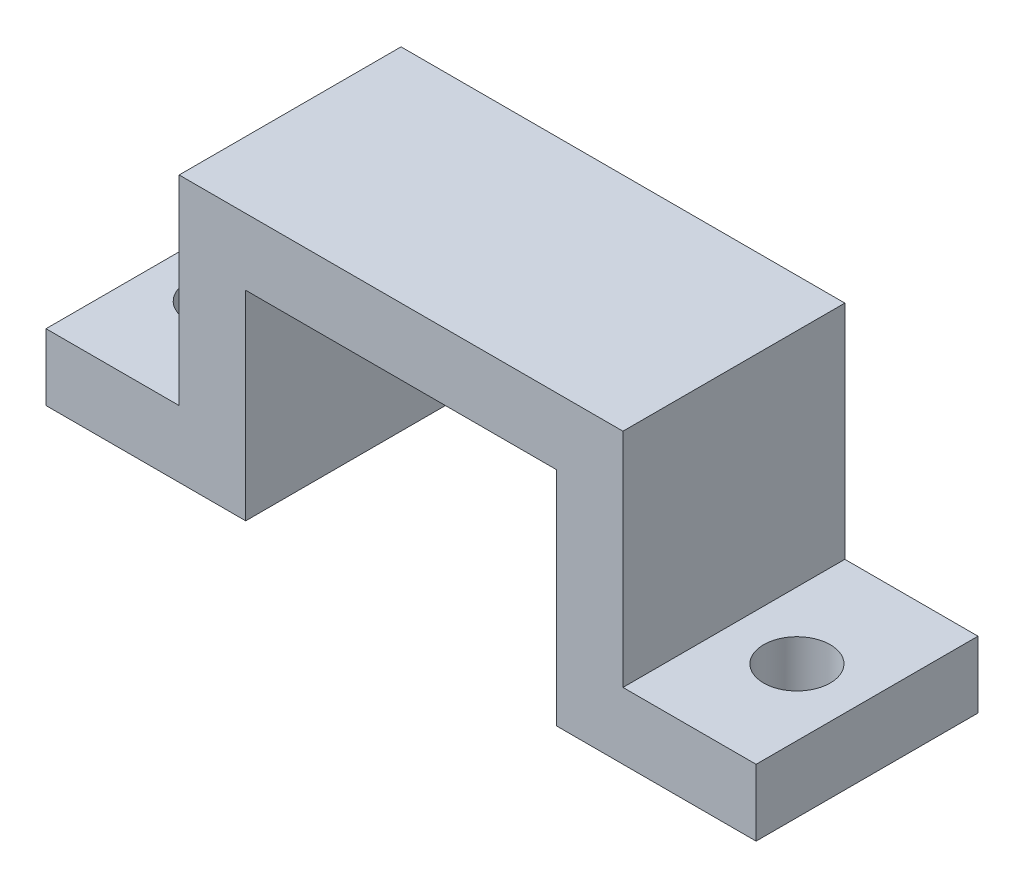
ISO-10303-21;
HEADER;
FILE_DESCRIPTION(('STEP AP214'),'2;1');
FILE_NAME('part.step','',(''),(''),'','','');
FILE_SCHEMA(('AUTOMOTIVE_DESIGN { 1 0 10303 214 1 1 1 1 }'));
ENDSEC;
DATA;
#1=APPLICATION_CONTEXT('core data for automotive mechanical design processes');
#2=APPLICATION_PROTOCOL_DEFINITION('international standard','automotive_design',2000,#1);
#3=PRODUCT_CONTEXT('',#1,'mechanical');
#4=PRODUCT('Part','Part','',(#3));
#5=PRODUCT_RELATED_PRODUCT_CATEGORY('part','',(#4));
#6=PRODUCT_DEFINITION_FORMATION('','',#4);
#7=PRODUCT_DEFINITION_CONTEXT('part definition',#1,'design');
#8=PRODUCT_DEFINITION('design','',#6,#7);
#9=PRODUCT_DEFINITION_SHAPE('','',#8);
#10=(LENGTH_UNIT() NAMED_UNIT(*) SI_UNIT(.MILLI.,.METRE.));
#11=(NAMED_UNIT(*) PLANE_ANGLE_UNIT() SI_UNIT($,.RADIAN.));
#12=(NAMED_UNIT(*) SI_UNIT($,.STERADIAN.) SOLID_ANGLE_UNIT());
#13=UNCERTAINTY_MEASURE_WITH_UNIT(LENGTH_MEASURE(1.E-05),#10,'distance_accuracy_value','');
#14=(GEOMETRIC_REPRESENTATION_CONTEXT(3) GLOBAL_UNCERTAINTY_ASSIGNED_CONTEXT((#13)) GLOBAL_UNIT_ASSIGNED_CONTEXT((#10,
#11,#12)) REPRESENTATION_CONTEXT('',''));
#15=CARTESIAN_POINT('',(0.,0.,0.));
#16=DIRECTION('',(0.,0.,1.));
#17=DIRECTION('',(1.,0.,0.));
#18=AXIS2_PLACEMENT_3D('',#15,#16,#17);
#19=CARTESIAN_POINT('',(26.,9.,0.));
#20=DIRECTION('',(0.,1.,0.));
#21=DIRECTION('',(0.,0.,1.));
#22=AXIS2_PLACEMENT_3D('',#19,#20,#21);
#23=PLANE('',#22);
#24=DIRECTION('',(0.,0.,-1.));
#25=VECTOR('',#24,1.);
#26=CARTESIAN_POINT('',(23.,9.,0.));
#27=LINE('',#26,#25);
#28=CARTESIAN_POINT('',(23.,9.,0.));
#29=VERTEX_POINT('',#28);
#30=CARTESIAN_POINT('',(23.,9.,-10.));
#31=VERTEX_POINT('',#30);
#32=EDGE_CURVE('E149',#29,#31,#27,.T.);
#33=ORIENTED_EDGE('',*,*,#32,.F.);
#34=DIRECTION('',(-1.,0.,0.));
#35=VECTOR('',#34,1.);
#36=CARTESIAN_POINT('',(26.,9.,0.));
#37=LINE('',#36,#35);
#38=CARTESIAN_POINT('',(9.,9.,0.));
#39=VERTEX_POINT('',#38);
#40=EDGE_CURVE('E69',#29,#39,#37,.T.);
#41=ORIENTED_EDGE('',*,*,#40,.T.);
#42=DIRECTION('',(0.,0.,-1.));
#43=VECTOR('',#42,1.);
#44=CARTESIAN_POINT('',(9.,9.,0.));
#45=LINE('',#44,#43);
#46=CARTESIAN_POINT('',(9.,9.,-10.));
#47=VERTEX_POINT('',#46);
#48=EDGE_CURVE('E196',#39,#47,#45,.T.);
#49=ORIENTED_EDGE('',*,*,#48,.T.);
#50=DIRECTION('',(-1.,0.,0.));
#51=VECTOR('',#50,1.);
#52=CARTESIAN_POINT('',(26.,9.,-10.));
#53=LINE('',#52,#51);
#54=EDGE_CURVE('E207',#31,#47,#53,.T.);
#55=ORIENTED_EDGE('',*,*,#54,.F.);
#56=EDGE_LOOP('',(#33,#41,#49,#55));
#57=FACE_BOUND('',#56,.T.);
#58=ADVANCED_FACE('F43',(#57),#23,.F.);
#59=CARTESIAN_POINT('',(9.,3.,0.));
#60=DIRECTION('',(-1.,0.,0.));
#61=DIRECTION('',(0.,0.,1.));
#62=AXIS2_PLACEMENT_3D('',#59,#60,#61);
#63=PLANE('',#62);
#64=ORIENTED_EDGE('',*,*,#48,.F.);
#65=DIRECTION('',(0.,-1.,0.));
#66=VECTOR('',#65,1.);
#67=CARTESIAN_POINT('',(9.,3.,0.));
#68=LINE('',#67,#66);
#69=CARTESIAN_POINT('',(9.,0.,0.));
#70=VERTEX_POINT('',#69);
#71=EDGE_CURVE('E53',#39,#70,#68,.T.);
#72=ORIENTED_EDGE('',*,*,#71,.T.);
#73=DIRECTION('',(0.,0.,-1.));
#74=VECTOR('',#73,1.);
#75=CARTESIAN_POINT('',(9.,0.,0.));
#76=LINE('',#75,#74);
#77=CARTESIAN_POINT('',(9.,0.,-10.));
#78=VERTEX_POINT('',#77);
#79=EDGE_CURVE('E254',#70,#78,#76,.T.);
#80=ORIENTED_EDGE('',*,*,#79,.T.);
#81=DIRECTION('',(0.,-1.,0.));
#82=VECTOR('',#81,1.);
#83=CARTESIAN_POINT('',(9.,3.,-10.));
#84=LINE('',#83,#82);
#85=EDGE_CURVE('E263',#47,#78,#84,.T.);
#86=ORIENTED_EDGE('',*,*,#85,.F.);
#87=EDGE_LOOP('',(#64,#72,#80,#86));
#88=FACE_BOUND('',#87,.T.);
#89=ADVANCED_FACE('F284',(#88),#63,.F.);
#90=CARTESIAN_POINT('',(0.,3.,0.));
#91=DIRECTION('',(0.,-1.,0.));
#92=DIRECTION('',(0.,0.,-1.));
#93=AXIS2_PLACEMENT_3D('',#90,#91,#92);
#94=PLANE('',#93);
#95=CARTESIAN_POINT('',(2.85155636367709,3.,-5.));
#96=DIRECTION('',(0.,1.,0.));
#97=DIRECTION('',(0.,0.,1.));
#98=AXIS2_PLACEMENT_3D('',#95,#96,#97);
#99=CIRCLE('',#98,1.5);
#100=CARTESIAN_POINT('',(2.85155636367709,3.,-3.5));
#101=VERTEX_POINT('',#100);
#102=EDGE_CURVE('E270',#101,#101,#99,.T.);
#103=ORIENTED_EDGE('',*,*,#102,.F.);
#104=EDGE_LOOP('',(#103));
#105=FACE_BOUND('',#104,.T.);
#106=DIRECTION('',(0.,0.,1.));
#107=VECTOR('',#106,1.);
#108=CARTESIAN_POINT('',(6.,3.,-10.));
#109=LINE('',#108,#107);
#110=CARTESIAN_POINT('',(6.,3.,-10.));
#111=VERTEX_POINT('',#110);
#112=CARTESIAN_POINT('',(6.,3.,0.));
#113=VERTEX_POINT('',#112);
#114=EDGE_CURVE('E214',#111,#113,#109,.T.);
#115=ORIENTED_EDGE('',*,*,#114,.F.);
#116=DIRECTION('',(-1.,0.,0.));
#117=VECTOR('',#116,1.);
#118=CARTESIAN_POINT('',(0.,3.,-10.));
#119=LINE('',#118,#117);
#120=CARTESIAN_POINT('',(0.,3.,-10.));
#121=VERTEX_POINT('',#120);
#122=EDGE_CURVE('E244',#111,#121,#119,.T.);
#123=ORIENTED_EDGE('',*,*,#122,.T.);
#124=DIRECTION('',(0.,0.,1.));
#125=VECTOR('',#124,1.);
#126=CARTESIAN_POINT('',(0.,3.,0.));
#127=LINE('',#126,#125);
#128=CARTESIAN_POINT('',(0.,3.,0.));
#129=VERTEX_POINT('',#128);
#130=EDGE_CURVE('E236',#121,#129,#127,.T.);
#131=ORIENTED_EDGE('',*,*,#130,.T.);
#132=DIRECTION('',(1.,0.,0.));
#133=VECTOR('',#132,1.);
#134=CARTESIAN_POINT('',(0.,3.,0.));
#135=LINE('',#134,#133);
#136=EDGE_CURVE('E240',#129,#113,#135,.T.);
#137=ORIENTED_EDGE('',*,*,#136,.T.);
#138=EDGE_LOOP('',(#115,#123,#131,#137));
#139=FACE_BOUND('',#138,.T.);
#140=ADVANCED_FACE('F281',(#105,#139),#94,.F.);
#141=CARTESIAN_POINT('',(0.,3.,0.));
#142=DIRECTION('',(1.,0.,0.));
#143=DIRECTION('',(0.,0.,-1.));
#144=AXIS2_PLACEMENT_3D('',#141,#142,#143);
#145=PLANE('',#144);
#146=DIRECTION('',(0.,0.,1.));
#147=VECTOR('',#146,1.);
#148=CARTESIAN_POINT('',(0.,0.,0.));
#149=LINE('',#148,#147);
#150=CARTESIAN_POINT('',(0.,0.,-10.));
#151=VERTEX_POINT('',#150);
#152=CARTESIAN_POINT('',(0.,0.,0.));
#153=VERTEX_POINT('',#152);
#154=EDGE_CURVE('E235',#151,#153,#149,.T.);
#155=ORIENTED_EDGE('',*,*,#154,.T.);
#156=DIRECTION('',(0.,-1.,0.));
#157=VECTOR('',#156,1.);
#158=CARTESIAN_POINT('',(0.,3.,0.));
#159=LINE('',#158,#157);
#160=EDGE_CURVE('E11',#129,#153,#159,.T.);
#161=ORIENTED_EDGE('',*,*,#160,.F.);
#162=ORIENTED_EDGE('',*,*,#130,.F.);
#163=DIRECTION('',(0.,-1.,0.));
#164=VECTOR('',#163,1.);
#165=CARTESIAN_POINT('',(0.,3.,-10.));
#166=LINE('',#165,#164);
#167=EDGE_CURVE('E247',#121,#151,#166,.T.);
#168=ORIENTED_EDGE('',*,*,#167,.T.);
#169=EDGE_LOOP('',(#155,#161,#162,#168));
#170=FACE_BOUND('',#169,.T.);
#171=ADVANCED_FACE('F45',(#170),#145,.F.);
#172=CARTESIAN_POINT('',(0.,3.,0.));
#173=DIRECTION('',(0.,0.,-1.));
#174=DIRECTION('',(-1.,0.,0.));
#175=AXIS2_PLACEMENT_3D('',#172,#173,#174);
#176=PLANE('',#175);
#177=DIRECTION('',(1.,0.,0.));
#178=VECTOR('',#177,1.);
#179=CARTESIAN_POINT('',(0.,0.,0.));
#180=LINE('',#179,#178);
#181=EDGE_CURVE('E251',#153,#70,#180,.T.);
#182=ORIENTED_EDGE('',*,*,#181,.T.);
#183=ORIENTED_EDGE('',*,*,#71,.F.);
#184=ORIENTED_EDGE('',*,*,#40,.F.);
#185=DIRECTION('',(0.,1.,0.));
#186=VECTOR('',#185,1.);
#187=CARTESIAN_POINT('',(23.,-0.999999999999999,0.));
#188=LINE('',#187,#186);
#189=CARTESIAN_POINT('',(23.,-0.999999999999999,0.));
#190=VERTEX_POINT('',#189);
#191=EDGE_CURVE('E144',#190,#29,#188,.T.);
#192=ORIENTED_EDGE('',*,*,#191,.F.);
#193=DIRECTION('',(-1.,0.,0.));
#194=VECTOR('',#193,1.);
#195=CARTESIAN_POINT('',(26.,-0.999999999999999,0.));
#196=LINE('',#195,#194);
#197=CARTESIAN_POINT('',(32.,-0.999999999999999,0.));
#198=VERTEX_POINT('',#197);
#199=EDGE_CURVE('E137',#198,#190,#196,.T.);
#200=ORIENTED_EDGE('',*,*,#199,.F.);
#201=DIRECTION('',(0.,-1.,0.));
#202=VECTOR('',#201,1.);
#203=CARTESIAN_POINT('',(32.,-0.999999999999999,0.));
#204=LINE('',#203,#202);
#205=CARTESIAN_POINT('',(32.,2.,0.));
#206=VERTEX_POINT('',#205);
#207=EDGE_CURVE('E143',#206,#198,#204,.T.);
#208=ORIENTED_EDGE('',*,*,#207,.F.);
#209=DIRECTION('',(-1.,0.,0.));
#210=VECTOR('',#209,1.);
#211=CARTESIAN_POINT('',(32.,2.,0.));
#212=LINE('',#211,#210);
#213=CARTESIAN_POINT('',(26.,2.,0.));
#214=VERTEX_POINT('',#213);
#215=EDGE_CURVE('E176',#206,#214,#212,.T.);
#216=ORIENTED_EDGE('',*,*,#215,.T.);
#217=DIRECTION('',(0.,-1.,0.));
#218=VECTOR('',#217,1.);
#219=CARTESIAN_POINT('',(26.,12.,0.));
#220=LINE('',#219,#218);
#221=CARTESIAN_POINT('',(26.,12.,0.));
#222=VERTEX_POINT('',#221);
#223=EDGE_CURVE('E197',#222,#214,#220,.T.);
#224=ORIENTED_EDGE('',*,*,#223,.F.);
#225=DIRECTION('',(1.,0.,0.));
#226=VECTOR('',#225,1.);
#227=CARTESIAN_POINT('',(9.,12.,0.));
#228=LINE('',#227,#226);
#229=CARTESIAN_POINT('',(6.,12.,0.));
#230=VERTEX_POINT('',#229);
#231=EDGE_CURVE('E221',#230,#222,#228,.T.);
#232=ORIENTED_EDGE('',*,*,#231,.F.);
#233=DIRECTION('',(0.,-1.,0.));
#234=VECTOR('',#233,1.);
#235=CARTESIAN_POINT('',(6.,12.,0.));
#236=LINE('',#235,#234);
#237=EDGE_CURVE('E224',#230,#113,#236,.T.);
#238=ORIENTED_EDGE('',*,*,#237,.T.);
#239=ORIENTED_EDGE('',*,*,#136,.F.);
#240=ORIENTED_EDGE('',*,*,#160,.T.);
#241=EDGE_LOOP('',(#182,#183,#184,#192,#200,#208,#216,#224,#232,#238,#239,#240));
#242=FACE_BOUND('',#241,.T.);
#243=ADVANCED_FACE('F140',(#242),#176,.F.);
#244=CARTESIAN_POINT('',(0.,3.,-10.));
#245=DIRECTION('',(0.,0.,1.));
#246=DIRECTION('',(1.,0.,0.));
#247=AXIS2_PLACEMENT_3D('',#244,#245,#246);
#248=PLANE('',#247);
#249=DIRECTION('',(-1.,0.,0.));
#250=VECTOR('',#249,1.);
#251=CARTESIAN_POINT('',(0.,0.,-10.));
#252=LINE('',#251,#250);
#253=EDGE_CURVE('E241',#78,#151,#252,.T.);
#254=ORIENTED_EDGE('',*,*,#253,.T.);
#255=ORIENTED_EDGE('',*,*,#167,.F.);
#256=ORIENTED_EDGE('',*,*,#122,.F.);
#257=DIRECTION('',(0.,-1.,0.));
#258=VECTOR('',#257,1.);
#259=CARTESIAN_POINT('',(6.,12.,-10.));
#260=LINE('',#259,#258);
#261=CARTESIAN_POINT('',(6.,12.,-10.));
#262=VERTEX_POINT('',#261);
#263=EDGE_CURVE('E231',#262,#111,#260,.T.);
#264=ORIENTED_EDGE('',*,*,#263,.F.);
#265=DIRECTION('',(-1.,0.,0.));
#266=VECTOR('',#265,1.);
#267=CARTESIAN_POINT('',(9.,12.,-10.));
#268=LINE('',#267,#266);
#269=CARTESIAN_POINT('',(26.,12.,-10.));
#270=VERTEX_POINT('',#269);
#271=EDGE_CURVE('E215',#270,#262,#268,.T.);
#272=ORIENTED_EDGE('',*,*,#271,.F.);
#273=DIRECTION('',(0.,1.,0.));
#274=VECTOR('',#273,1.);
#275=CARTESIAN_POINT('',(26.,12.,-10.));
#276=LINE('',#275,#274);
#277=CARTESIAN_POINT('',(26.,2.,-10.));
#278=VERTEX_POINT('',#277);
#279=EDGE_CURVE('E200',#278,#270,#276,.T.);
#280=ORIENTED_EDGE('',*,*,#279,.F.);
#281=DIRECTION('',(-1.,0.,0.));
#282=VECTOR('',#281,1.);
#283=CARTESIAN_POINT('',(32.,2.,-10.));
#284=LINE('',#283,#282);
#285=CARTESIAN_POINT('',(32.,2.,-10.));
#286=VERTEX_POINT('',#285);
#287=EDGE_CURVE('E180',#286,#278,#284,.T.);
#288=ORIENTED_EDGE('',*,*,#287,.F.);
#289=DIRECTION('',(0.,1.,0.));
#290=VECTOR('',#289,1.);
#291=CARTESIAN_POINT('',(32.,-0.999999999999999,-10.));
#292=LINE('',#291,#290);
#293=CARTESIAN_POINT('',(32.,-0.999999999999999,-10.));
#294=VERTEX_POINT('',#293);
#295=EDGE_CURVE('E159',#294,#286,#292,.T.);
#296=ORIENTED_EDGE('',*,*,#295,.F.);
#297=DIRECTION('',(1.,0.,0.));
#298=VECTOR('',#297,1.);
#299=CARTESIAN_POINT('',(26.,-0.999999999999999,-10.));
#300=LINE('',#299,#298);
#301=CARTESIAN_POINT('',(23.,-0.999999999999999,-10.));
#302=VERTEX_POINT('',#301);
#303=EDGE_CURVE('E155',#302,#294,#300,.T.);
#304=ORIENTED_EDGE('',*,*,#303,.F.);
#305=DIRECTION('',(0.,1.,0.));
#306=VECTOR('',#305,1.);
#307=CARTESIAN_POINT('',(23.,-0.999999999999999,-10.));
#308=LINE('',#307,#306);
#309=EDGE_CURVE('E188',#302,#31,#308,.T.);
#310=ORIENTED_EDGE('',*,*,#309,.T.);
#311=ORIENTED_EDGE('',*,*,#54,.T.);
#312=ORIENTED_EDGE('',*,*,#85,.T.);
#313=EDGE_LOOP('',(#254,#255,#256,#264,#272,#280,#288,#296,#304,#310,#311,#312));
#314=FACE_BOUND('',#313,.T.);
#315=ADVANCED_FACE('F292',(#314),#248,.F.);
#316=CARTESIAN_POINT('',(0.,0.,0.));
#317=DIRECTION('',(0.,-1.,0.));
#318=DIRECTION('',(0.,0.,-1.));
#319=AXIS2_PLACEMENT_3D('',#316,#317,#318);
#320=PLANE('',#319);
#321=CARTESIAN_POINT('',(2.85155636367709,0.,-5.));
#322=DIRECTION('',(0.,-1.,0.));
#323=DIRECTION('',(0.,0.,-1.));
#324=AXIS2_PLACEMENT_3D('',#321,#322,#323);
#325=CIRCLE('',#324,1.5);
#326=CARTESIAN_POINT('',(2.85155636367709,0.,-6.5));
#327=VERTEX_POINT('',#326);
#328=EDGE_CURVE('E47',#327,#327,#325,.T.);
#329=ORIENTED_EDGE('',*,*,#328,.F.);
#330=EDGE_LOOP('',(#329));
#331=FACE_BOUND('',#330,.T.);
#332=ORIENTED_EDGE('',*,*,#154,.F.);
#333=ORIENTED_EDGE('',*,*,#253,.F.);
#334=ORIENTED_EDGE('',*,*,#79,.F.);
#335=ORIENTED_EDGE('',*,*,#181,.F.);
#336=EDGE_LOOP('',(#332,#333,#334,#335));
#337=FACE_BOUND('',#336,.T.);
#338=ADVANCED_FACE('F325',(#331,#337),#320,.T.);
#339=CARTESIAN_POINT('',(6.,12.,-10.));
#340=DIRECTION('',(1.,0.,0.));
#341=DIRECTION('',(0.,0.,-1.));
#342=AXIS2_PLACEMENT_3D('',#339,#340,#341);
#343=PLANE('',#342);
#344=ORIENTED_EDGE('',*,*,#114,.T.);
#345=ORIENTED_EDGE('',*,*,#237,.F.);
#346=DIRECTION('',(0.,0.,1.));
#347=VECTOR('',#346,1.);
#348=CARTESIAN_POINT('',(6.,12.,-10.));
#349=LINE('',#348,#347);
#350=EDGE_CURVE('E218',#262,#230,#349,.T.);
#351=ORIENTED_EDGE('',*,*,#350,.F.);
#352=ORIENTED_EDGE('',*,*,#263,.T.);
#353=EDGE_LOOP('',(#344,#345,#351,#352));
#354=FACE_BOUND('',#353,.T.);
#355=ADVANCED_FACE('F296',(#354),#343,.F.);
#356=CARTESIAN_POINT('',(0.,12.,0.));
#357=DIRECTION('',(0.,-1.,0.));
#358=DIRECTION('',(0.,0.,-1.));
#359=AXIS2_PLACEMENT_3D('',#356,#357,#358);
#360=PLANE('',#359);
#361=ORIENTED_EDGE('',*,*,#231,.T.);
#362=DIRECTION('',(0.,0.,1.));
#363=VECTOR('',#362,1.);
#364=CARTESIAN_POINT('',(26.,12.,0.));
#365=LINE('',#364,#363);
#366=EDGE_CURVE('E203',#270,#222,#365,.T.);
#367=ORIENTED_EDGE('',*,*,#366,.F.);
#368=ORIENTED_EDGE('',*,*,#271,.T.);
#369=ORIENTED_EDGE('',*,*,#350,.T.);
#370=EDGE_LOOP('',(#361,#367,#368,#369));
#371=FACE_BOUND('',#370,.T.);
#372=ADVANCED_FACE('F299',(#371),#360,.F.);
#373=CARTESIAN_POINT('',(26.,0.,0.));
#374=DIRECTION('',(1.,0.,0.));
#375=DIRECTION('',(0.,0.,-1.));
#376=AXIS2_PLACEMENT_3D('',#373,#374,#375);
#377=PLANE('',#376);
#378=DIRECTION('',(0.,0.,1.));
#379=VECTOR('',#378,1.);
#380=CARTESIAN_POINT('',(26.,2.,0.));
#381=LINE('',#380,#379);
#382=EDGE_CURVE('E61',#278,#214,#381,.T.);
#383=ORIENTED_EDGE('',*,*,#382,.F.);
#384=ORIENTED_EDGE('',*,*,#279,.T.);
#385=ORIENTED_EDGE('',*,*,#366,.T.);
#386=ORIENTED_EDGE('',*,*,#223,.T.);
#387=EDGE_LOOP('',(#383,#384,#385,#386));
#388=FACE_BOUND('',#387,.T.);
#389=ADVANCED_FACE('F305',(#388),#377,.T.);
#390=CARTESIAN_POINT('',(23.,-0.999999999999999,0.));
#391=DIRECTION('',(1.,0.,0.));
#392=DIRECTION('',(0.,0.,-1.));
#393=AXIS2_PLACEMENT_3D('',#390,#391,#392);
#394=PLANE('',#393);
#395=ORIENTED_EDGE('',*,*,#32,.T.);
#396=ORIENTED_EDGE('',*,*,#309,.F.);
#397=DIRECTION('',(0.,0.,-1.));
#398=VECTOR('',#397,1.);
#399=CARTESIAN_POINT('',(23.,-0.999999999999999,0.));
#400=LINE('',#399,#398);
#401=EDGE_CURVE('E148',#190,#302,#400,.T.);
#402=ORIENTED_EDGE('',*,*,#401,.F.);
#403=ORIENTED_EDGE('',*,*,#191,.T.);
#404=EDGE_LOOP('',(#395,#396,#402,#403));
#405=FACE_BOUND('',#404,.T.);
#406=ADVANCED_FACE('F307',(#405),#394,.F.);
#407=CARTESIAN_POINT('',(0.,-0.999999999999999,0.));
#408=DIRECTION('',(0.,1.,0.));
#409=DIRECTION('',(0.,0.,1.));
#410=AXIS2_PLACEMENT_3D('',#407,#408,#409);
#411=PLANE('',#410);
#412=CARTESIAN_POINT('',(29.,-0.999999999999999,-4.84013329105456));
#413=DIRECTION('',(0.,1.,0.));
#414=DIRECTION('',(0.,0.,1.));
#415=AXIS2_PLACEMENT_3D('',#412,#413,#414);
#416=CIRCLE('',#415,1.5);
#417=CARTESIAN_POINT('',(29.,-0.999999999999999,-3.34013329105456));
#418=VERTEX_POINT('',#417);
#419=EDGE_CURVE('E170',#418,#418,#416,.T.);
#420=ORIENTED_EDGE('',*,*,#419,.T.);
#421=EDGE_LOOP('',(#420));
#422=FACE_BOUND('',#421,.T.);
#423=ORIENTED_EDGE('',*,*,#303,.T.);
#424=DIRECTION('',(0.,0.,-1.));
#425=VECTOR('',#424,1.);
#426=CARTESIAN_POINT('',(32.,-0.999999999999999,0.));
#427=LINE('',#426,#425);
#428=EDGE_CURVE('E152',#198,#294,#427,.T.);
#429=ORIENTED_EDGE('',*,*,#428,.F.);
#430=ORIENTED_EDGE('',*,*,#199,.T.);
#431=ORIENTED_EDGE('',*,*,#401,.T.);
#432=EDGE_LOOP('',(#423,#429,#430,#431));
#433=FACE_BOUND('',#432,.T.);
#434=ADVANCED_FACE('F153',(#422,#433),#411,.F.);
#435=CARTESIAN_POINT('',(32.,2.,0.));
#436=DIRECTION('',(0.,-1.,0.));
#437=DIRECTION('',(1.,0.,0.));
#438=AXIS2_PLACEMENT_3D('',#435,#436,#437);
#439=PLANE('',#438);
#440=CARTESIAN_POINT('',(29.,2.,-4.84013329105456));
#441=DIRECTION('',(0.,-1.,0.));
#442=DIRECTION('',(1.,0.,0.));
#443=AXIS2_PLACEMENT_3D('',#440,#441,#442);
#444=CIRCLE('',#443,1.5);
#445=CARTESIAN_POINT('',(30.5,2.,-4.84013329105456));
#446=VERTEX_POINT('',#445);
#447=EDGE_CURVE('E267',#446,#446,#444,.T.);
#448=ORIENTED_EDGE('',*,*,#447,.T.);
#449=EDGE_LOOP('',(#448));
#450=FACE_BOUND('',#449,.T.);
#451=ORIENTED_EDGE('',*,*,#382,.T.);
#452=ORIENTED_EDGE('',*,*,#215,.F.);
#453=DIRECTION('',(0.,0.,1.));
#454=VECTOR('',#453,1.);
#455=CARTESIAN_POINT('',(32.,2.,0.));
#456=LINE('',#455,#454);
#457=EDGE_CURVE('E163',#286,#206,#456,.T.);
#458=ORIENTED_EDGE('',*,*,#457,.F.);
#459=ORIENTED_EDGE('',*,*,#287,.T.);
#460=EDGE_LOOP('',(#451,#452,#458,#459));
#461=FACE_BOUND('',#460,.T.);
#462=ADVANCED_FACE('F303',(#450,#461),#439,.F.);
#463=CARTESIAN_POINT('',(32.,0.,0.));
#464=DIRECTION('',(-1.,0.,0.));
#465=DIRECTION('',(0.,0.,1.));
#466=AXIS2_PLACEMENT_3D('',#463,#464,#465);
#467=PLANE('',#466);
#468=ORIENTED_EDGE('',*,*,#207,.T.);
#469=ORIENTED_EDGE('',*,*,#428,.T.);
#470=ORIENTED_EDGE('',*,*,#295,.T.);
#471=ORIENTED_EDGE('',*,*,#457,.T.);
#472=EDGE_LOOP('',(#468,#469,#470,#471));
#473=FACE_BOUND('',#472,.T.);
#474=ADVANCED_FACE('F161',(#473),#467,.F.);
#475=CARTESIAN_POINT('',(29.,-3.,-4.84013329105456));
#476=DIRECTION('',(0.,1.,0.));
#477=DIRECTION('',(0.,0.,1.));
#478=AXIS2_PLACEMENT_3D('',#475,#476,#477);
#479=CYLINDRICAL_SURFACE('',#478,1.5);
#480=ORIENTED_EDGE('',*,*,#447,.F.);
#481=EDGE_LOOP('',(#480));
#482=FACE_BOUND('',#481,.T.);
#483=ORIENTED_EDGE('',*,*,#419,.F.);
#484=EDGE_LOOP('',(#483));
#485=FACE_BOUND('',#484,.T.);
#486=ADVANCED_FACE('F408',(#482,#485),#479,.F.);
#487=CARTESIAN_POINT('',(2.85155636367709,-3.,-5.));
#488=DIRECTION('',(0.,1.,0.));
#489=DIRECTION('',(0.,0.,1.));
#490=AXIS2_PLACEMENT_3D('',#487,#488,#489);
#491=CYLINDRICAL_SURFACE('',#490,1.5);
#492=ORIENTED_EDGE('',*,*,#328,.T.);
#493=EDGE_LOOP('',(#492));
#494=FACE_BOUND('',#493,.T.);
#495=ORIENTED_EDGE('',*,*,#102,.T.);
#496=EDGE_LOOP('',(#495));
#497=FACE_BOUND('',#496,.T.);
#498=ADVANCED_FACE('F279',(#494,#497),#491,.F.);
#499=CLOSED_SHELL('',(#58,#89,#140,#171,#243,#315,#338,#355,#372,#389,#406,#434,#462,#474,#486,#498));
#500=MANIFOLD_SOLID_BREP('B2',#499);
#501=ADVANCED_BREP_SHAPE_REPRESENTATION('',(#18,#500),#14);
#502=SHAPE_DEFINITION_REPRESENTATION(#9,#501);
ENDSEC;
END-ISO-10303-21;
